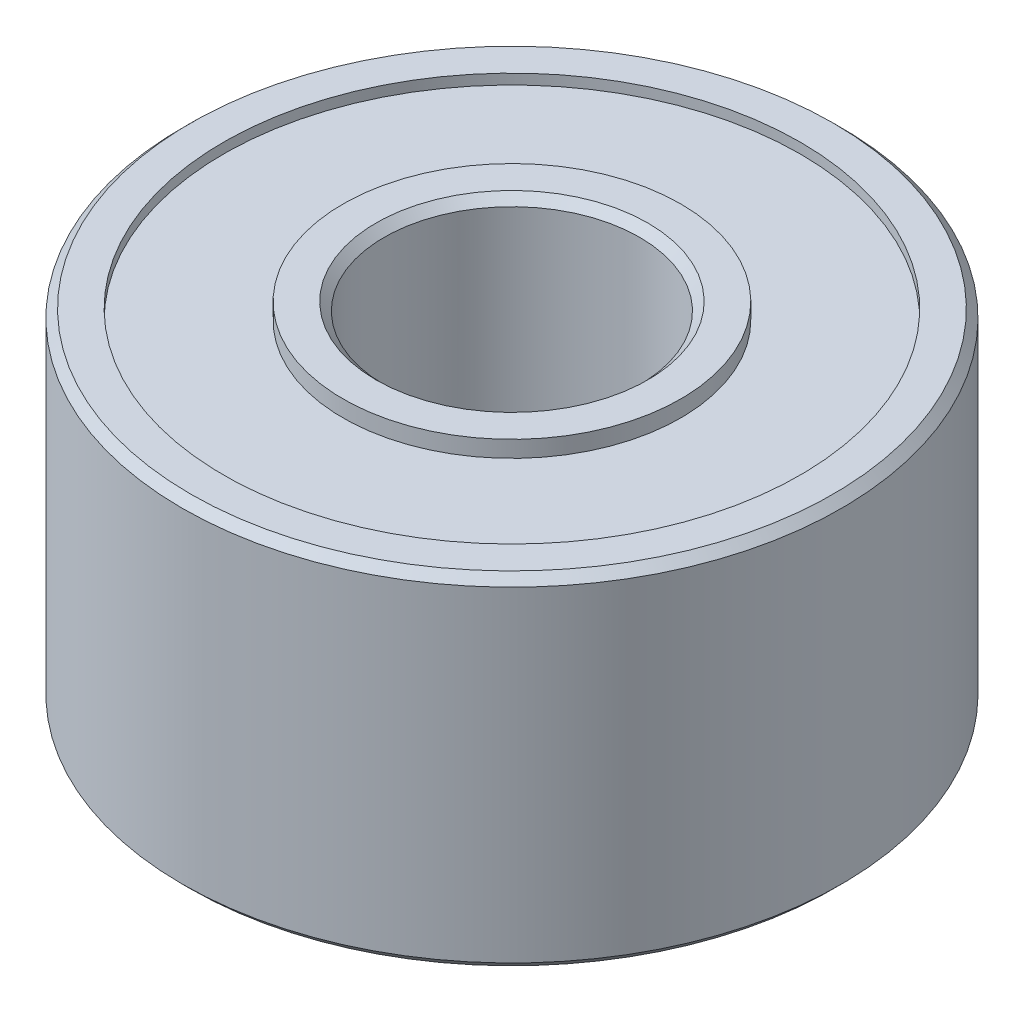
ISO-10303-21;
HEADER;
FILE_DESCRIPTION(('STEP AP214'),'2;1');
FILE_NAME('part.step','',(''),(''),'','','');
FILE_SCHEMA(('AUTOMOTIVE_DESIGN { 1 0 10303 214 1 1 1 1 }'));
ENDSEC;
DATA;
#1=APPLICATION_CONTEXT('core data for automotive mechanical design processes');
#2=APPLICATION_PROTOCOL_DEFINITION('international standard','automotive_design',2000,#1);
#3=PRODUCT_CONTEXT('',#1,'mechanical');
#4=PRODUCT('Part','Part','',(#3));
#5=PRODUCT_RELATED_PRODUCT_CATEGORY('part','',(#4));
#6=PRODUCT_DEFINITION_FORMATION('','',#4);
#7=PRODUCT_DEFINITION_CONTEXT('part definition',#1,'design');
#8=PRODUCT_DEFINITION('design','',#6,#7);
#9=PRODUCT_DEFINITION_SHAPE('','',#8);
#10=(LENGTH_UNIT() NAMED_UNIT(*) SI_UNIT(.MILLI.,.METRE.));
#11=(NAMED_UNIT(*) PLANE_ANGLE_UNIT() SI_UNIT($,.RADIAN.));
#12=(NAMED_UNIT(*) SI_UNIT($,.STERADIAN.) SOLID_ANGLE_UNIT());
#13=UNCERTAINTY_MEASURE_WITH_UNIT(LENGTH_MEASURE(1.E-05),#10,'distance_accuracy_value','');
#14=(GEOMETRIC_REPRESENTATION_CONTEXT(3) GLOBAL_UNCERTAINTY_ASSIGNED_CONTEXT((#13)) GLOBAL_UNIT_ASSIGNED_CONTEXT((#10,
#11,#12)) REPRESENTATION_CONTEXT('',''));
#15=CARTESIAN_POINT('',(0.,0.,0.));
#16=DIRECTION('',(0.,0.,1.));
#17=DIRECTION('',(1.,0.,0.));
#18=AXIS2_PLACEMENT_3D('',#15,#16,#17);
#19=CARTESIAN_POINT('',(0.,-2.,0.));
#20=DIRECTION('',(0.,-1.,0.));
#21=DIRECTION('',(0.,0.,-1.));
#22=AXIS2_PLACEMENT_3D('',#19,#20,#21);
#23=CYLINDRICAL_SURFACE('',#22,4.);
#24=CARTESIAN_POINT('',(0.,-1.975,0.));
#25=DIRECTION('',(0.,-1.,0.));
#26=DIRECTION('',(0.,0.,-1.));
#27=AXIS2_PLACEMENT_3D('',#24,#25,#26);
#28=CIRCLE('',#27,4.);
#29=CARTESIAN_POINT('',(0.,-1.975,4.));
#30=VERTEX_POINT('',#29);
#31=EDGE_CURVE('E59',#30,#30,#28,.F.);
#32=ORIENTED_EDGE('',*,*,#31,.T.);
#33=EDGE_LOOP('',(#32));
#34=FACE_BOUND('',#33,.T.);
#35=CARTESIAN_POINT('',(0.,1.975,0.));
#36=DIRECTION('',(0.,1.,0.));
#37=DIRECTION('',(0.,0.,1.));
#38=AXIS2_PLACEMENT_3D('',#35,#36,#37);
#39=CIRCLE('',#38,4.);
#40=CARTESIAN_POINT('',(0.,1.975,4.));
#41=VERTEX_POINT('',#40);
#42=EDGE_CURVE('E64',#41,#41,#39,.F.);
#43=ORIENTED_EDGE('',*,*,#42,.T.);
#44=EDGE_LOOP('',(#43));
#45=FACE_BOUND('',#44,.T.);
#46=ADVANCED_FACE('F45',(#34,#45),#23,.T.);
#47=CARTESIAN_POINT('',(4.,2.075,0.));
#48=DIRECTION('',(0.,1.,0.));
#49=DIRECTION('',(0.,0.,1.));
#50=AXIS2_PLACEMENT_3D('',#47,#48,#49);
#51=PLANE('',#50);
#52=CARTESIAN_POINT('',(0.,2.075,0.));
#53=DIRECTION('',(0.,1.,0.));
#54=DIRECTION('',(0.,0.,1.));
#55=AXIS2_PLACEMENT_3D('',#52,#53,#54);
#56=CIRCLE('',#55,3.9);
#57=CARTESIAN_POINT('',(0.,2.075,3.9));
#58=VERTEX_POINT('',#57);
#59=EDGE_CURVE('E10',#58,#58,#56,.T.);
#60=ORIENTED_EDGE('',*,*,#59,.T.);
#61=EDGE_LOOP('',(#60));
#62=FACE_BOUND('',#61,.T.);
#63=CARTESIAN_POINT('',(0.,2.075,0.));
#64=DIRECTION('',(0.,-1.,0.));
#65=DIRECTION('',(0.,0.,-1.));
#66=AXIS2_PLACEMENT_3D('',#63,#64,#65);
#67=CIRCLE('',#66,3.5);
#68=CARTESIAN_POINT('',(0.,2.075,-3.5));
#69=VERTEX_POINT('',#68);
#70=EDGE_CURVE('E86',#69,#69,#67,.T.);
#71=ORIENTED_EDGE('',*,*,#70,.T.);
#72=EDGE_LOOP('',(#71));
#73=FACE_BOUND('',#72,.T.);
#74=ADVANCED_FACE('F138',(#62,#73),#51,.T.);
#75=CARTESIAN_POINT('',(0.,-2.,0.));
#76=DIRECTION('',(0.,-1.,0.));
#77=DIRECTION('',(0.,0.,-1.));
#78=AXIS2_PLACEMENT_3D('',#75,#76,#77);
#79=CYLINDRICAL_SURFACE('',#78,3.5);
#80=CARTESIAN_POINT('',(0.,1.95,0.));
#81=DIRECTION('',(0.,-1.,0.));
#82=DIRECTION('',(0.,0.,-1.));
#83=AXIS2_PLACEMENT_3D('',#80,#81,#82);
#84=CIRCLE('',#83,3.5);
#85=CARTESIAN_POINT('',(0.,1.95,-3.5));
#86=VERTEX_POINT('',#85);
#87=EDGE_CURVE('E90',#86,#86,#84,.T.);
#88=ORIENTED_EDGE('',*,*,#87,.T.);
#89=EDGE_LOOP('',(#88));
#90=FACE_BOUND('',#89,.T.);
#91=ORIENTED_EDGE('',*,*,#70,.F.);
#92=EDGE_LOOP('',(#91));
#93=FACE_BOUND('',#92,.T.);
#94=ADVANCED_FACE('F144',(#90,#93),#79,.F.);
#95=CARTESIAN_POINT('',(3.5,1.95,0.));
#96=DIRECTION('',(0.,1.,0.));
#97=DIRECTION('',(0.,0.,1.));
#98=AXIS2_PLACEMENT_3D('',#95,#96,#97);
#99=PLANE('',#98);
#100=CARTESIAN_POINT('',(0.,1.95,0.));
#101=DIRECTION('',(0.,-1.,0.));
#102=DIRECTION('',(0.,0.,-1.));
#103=AXIS2_PLACEMENT_3D('',#100,#101,#102);
#104=CIRCLE('',#103,2.05);
#105=CARTESIAN_POINT('',(0.,1.95,-2.05));
#106=VERTEX_POINT('',#105);
#107=EDGE_CURVE('E94',#106,#106,#104,.T.);
#108=ORIENTED_EDGE('',*,*,#107,.T.);
#109=EDGE_LOOP('',(#108));
#110=FACE_BOUND('',#109,.T.);
#111=ORIENTED_EDGE('',*,*,#87,.F.);
#112=EDGE_LOOP('',(#111));
#113=FACE_BOUND('',#112,.T.);
#114=ADVANCED_FACE('F188',(#110,#113),#99,.T.);
#115=CARTESIAN_POINT('',(0.,-2.,0.));
#116=DIRECTION('',(0.,-1.,0.));
#117=DIRECTION('',(0.,0.,-1.));
#118=AXIS2_PLACEMENT_3D('',#115,#116,#117);
#119=CYLINDRICAL_SURFACE('',#118,2.05);
#120=CARTESIAN_POINT('',(0.,2.15,0.));
#121=DIRECTION('',(0.,-1.,0.));
#122=DIRECTION('',(0.,0.,-1.));
#123=AXIS2_PLACEMENT_3D('',#120,#121,#122);
#124=CIRCLE('',#123,2.05);
#125=CARTESIAN_POINT('',(0.,2.15,-2.05));
#126=VERTEX_POINT('',#125);
#127=EDGE_CURVE('E98',#126,#126,#124,.T.);
#128=ORIENTED_EDGE('',*,*,#127,.T.);
#129=EDGE_LOOP('',(#128));
#130=FACE_BOUND('',#129,.T.);
#131=ORIENTED_EDGE('',*,*,#107,.F.);
#132=EDGE_LOOP('',(#131));
#133=FACE_BOUND('',#132,.T.);
#134=ADVANCED_FACE('F182',(#130,#133),#119,.T.);
#135=CARTESIAN_POINT('',(2.05,2.15,0.));
#136=DIRECTION('',(0.,1.,0.));
#137=DIRECTION('',(0.,0.,1.));
#138=AXIS2_PLACEMENT_3D('',#135,#136,#137);
#139=PLANE('',#138);
#140=CARTESIAN_POINT('',(0.,2.15,0.));
#141=DIRECTION('',(0.,1.,0.));
#142=DIRECTION('',(0.,0.,1.));
#143=AXIS2_PLACEMENT_3D('',#140,#141,#142);
#144=CIRCLE('',#143,1.65);
#145=CARTESIAN_POINT('',(0.,2.15,1.65));
#146=VERTEX_POINT('',#145);
#147=EDGE_CURVE('E54',#146,#146,#144,.F.);
#148=ORIENTED_EDGE('',*,*,#147,.T.);
#149=EDGE_LOOP('',(#148));
#150=FACE_BOUND('',#149,.T.);
#151=ORIENTED_EDGE('',*,*,#127,.F.);
#152=EDGE_LOOP('',(#151));
#153=FACE_BOUND('',#152,.T.);
#154=ADVANCED_FACE('F173',(#150,#153),#139,.T.);
#155=CARTESIAN_POINT('',(0.,-2.,0.));
#156=DIRECTION('',(0.,-1.,0.));
#157=DIRECTION('',(0.,0.,-1.));
#158=AXIS2_PLACEMENT_3D('',#155,#156,#157);
#159=CYLINDRICAL_SURFACE('',#158,1.55);
#160=CARTESIAN_POINT('',(0.,-2.05,0.));
#161=DIRECTION('',(0.,-1.,0.));
#162=DIRECTION('',(0.,0.,-1.));
#163=AXIS2_PLACEMENT_3D('',#160,#161,#162);
#164=CIRCLE('',#163,1.55);
#165=CARTESIAN_POINT('',(0.,-2.05,-1.55));
#166=VERTEX_POINT('',#165);
#167=EDGE_CURVE('E78',#166,#166,#164,.T.);
#168=ORIENTED_EDGE('',*,*,#167,.T.);
#169=EDGE_LOOP('',(#168));
#170=FACE_BOUND('',#169,.T.);
#171=CARTESIAN_POINT('',(0.,2.05,0.));
#172=DIRECTION('',(0.,1.,0.));
#173=DIRECTION('',(0.,0.,1.));
#174=AXIS2_PLACEMENT_3D('',#171,#172,#173);
#175=CIRCLE('',#174,1.55);
#176=CARTESIAN_POINT('',(0.,2.05,1.55));
#177=VERTEX_POINT('',#176);
#178=EDGE_CURVE('E82',#177,#177,#175,.T.);
#179=ORIENTED_EDGE('',*,*,#178,.T.);
#180=EDGE_LOOP('',(#179));
#181=FACE_BOUND('',#180,.T.);
#182=ADVANCED_FACE('F170',(#170,#181),#159,.F.);
#183=CARTESIAN_POINT('',(1.55,-2.15,0.));
#184=DIRECTION('',(0.,-1.,0.));
#185=DIRECTION('',(0.,0.,-1.));
#186=AXIS2_PLACEMENT_3D('',#183,#184,#185);
#187=PLANE('',#186);
#188=CARTESIAN_POINT('',(0.,-2.15,0.));
#189=DIRECTION('',(0.,-1.,0.));
#190=DIRECTION('',(0.,0.,-1.));
#191=AXIS2_PLACEMENT_3D('',#188,#189,#190);
#192=CIRCLE('',#191,1.65000000000001);
#193=CARTESIAN_POINT('',(0.,-2.15,-1.65000000000001));
#194=VERTEX_POINT('',#193);
#195=EDGE_CURVE('E74',#194,#194,#192,.F.);
#196=ORIENTED_EDGE('',*,*,#195,.T.);
#197=EDGE_LOOP('',(#196));
#198=FACE_BOUND('',#197,.T.);
#199=CARTESIAN_POINT('',(0.,-2.15,0.));
#200=DIRECTION('',(0.,-1.,0.));
#201=DIRECTION('',(0.,0.,-1.));
#202=AXIS2_PLACEMENT_3D('',#199,#200,#201);
#203=CIRCLE('',#202,2.05);
#204=CARTESIAN_POINT('',(0.,-2.15,-2.05));
#205=VERTEX_POINT('',#204);
#206=EDGE_CURVE('E102',#205,#205,#203,.T.);
#207=ORIENTED_EDGE('',*,*,#206,.T.);
#208=EDGE_LOOP('',(#207));
#209=FACE_BOUND('',#208,.T.);
#210=ADVANCED_FACE('F172',(#198,#209),#187,.T.);
#211=CARTESIAN_POINT('',(0.,-2.,0.));
#212=DIRECTION('',(0.,-1.,0.));
#213=DIRECTION('',(0.,0.,-1.));
#214=AXIS2_PLACEMENT_3D('',#211,#212,#213);
#215=CYLINDRICAL_SURFACE('',#214,2.05);
#216=CARTESIAN_POINT('',(0.,-1.95,0.));
#217=DIRECTION('',(0.,-1.,0.));
#218=DIRECTION('',(0.,0.,-1.));
#219=AXIS2_PLACEMENT_3D('',#216,#217,#218);
#220=CIRCLE('',#219,2.05);
#221=CARTESIAN_POINT('',(0.,-1.95,-2.05));
#222=VERTEX_POINT('',#221);
#223=EDGE_CURVE('E106',#222,#222,#220,.T.);
#224=ORIENTED_EDGE('',*,*,#223,.T.);
#225=EDGE_LOOP('',(#224));
#226=FACE_BOUND('',#225,.T.);
#227=ORIENTED_EDGE('',*,*,#206,.F.);
#228=EDGE_LOOP('',(#227));
#229=FACE_BOUND('',#228,.T.);
#230=ADVANCED_FACE('F179',(#226,#229),#215,.T.);
#231=CARTESIAN_POINT('',(2.05,-1.95,0.));
#232=DIRECTION('',(0.,-1.,0.));
#233=DIRECTION('',(0.,0.,-1.));
#234=AXIS2_PLACEMENT_3D('',#231,#232,#233);
#235=PLANE('',#234);
#236=CARTESIAN_POINT('',(0.,-1.95,0.));
#237=DIRECTION('',(0.,-1.,0.));
#238=DIRECTION('',(0.,0.,-1.));
#239=AXIS2_PLACEMENT_3D('',#236,#237,#238);
#240=CIRCLE('',#239,3.5);
#241=CARTESIAN_POINT('',(0.,-1.95,-3.5));
#242=VERTEX_POINT('',#241);
#243=EDGE_CURVE('E110',#242,#242,#240,.T.);
#244=ORIENTED_EDGE('',*,*,#243,.T.);
#245=EDGE_LOOP('',(#244));
#246=FACE_BOUND('',#245,.T.);
#247=ORIENTED_EDGE('',*,*,#223,.F.);
#248=EDGE_LOOP('',(#247));
#249=FACE_BOUND('',#248,.T.);
#250=ADVANCED_FACE('F135',(#246,#249),#235,.T.);
#251=CARTESIAN_POINT('',(0.,-2.,0.));
#252=DIRECTION('',(0.,-1.,0.));
#253=DIRECTION('',(0.,0.,-1.));
#254=AXIS2_PLACEMENT_3D('',#251,#252,#253);
#255=CYLINDRICAL_SURFACE('',#254,3.5);
#256=CARTESIAN_POINT('',(0.,-2.075,0.));
#257=DIRECTION('',(0.,-1.,0.));
#258=DIRECTION('',(0.,0.,-1.));
#259=AXIS2_PLACEMENT_3D('',#256,#257,#258);
#260=CIRCLE('',#259,3.5);
#261=CARTESIAN_POINT('',(0.,-2.075,-3.5));
#262=VERTEX_POINT('',#261);
#263=EDGE_CURVE('E114',#262,#262,#260,.T.);
#264=ORIENTED_EDGE('',*,*,#263,.T.);
#265=EDGE_LOOP('',(#264));
#266=FACE_BOUND('',#265,.T.);
#267=ORIENTED_EDGE('',*,*,#243,.F.);
#268=EDGE_LOOP('',(#267));
#269=FACE_BOUND('',#268,.T.);
#270=ADVANCED_FACE('F119',(#266,#269),#255,.F.);
#271=CARTESIAN_POINT('',(3.5,-2.075,0.));
#272=DIRECTION('',(0.,-1.,0.));
#273=DIRECTION('',(0.,0.,-1.));
#274=AXIS2_PLACEMENT_3D('',#271,#272,#273);
#275=PLANE('',#274);
#276=CARTESIAN_POINT('',(0.,-2.075,0.));
#277=DIRECTION('',(0.,-1.,0.));
#278=DIRECTION('',(0.,0.,-1.));
#279=AXIS2_PLACEMENT_3D('',#276,#277,#278);
#280=CIRCLE('',#279,3.9);
#281=CARTESIAN_POINT('',(0.,-2.075,3.9));
#282=VERTEX_POINT('',#281);
#283=EDGE_CURVE('E70',#282,#282,#280,.T.);
#284=ORIENTED_EDGE('',*,*,#283,.T.);
#285=EDGE_LOOP('',(#284));
#286=FACE_BOUND('',#285,.T.);
#287=ORIENTED_EDGE('',*,*,#263,.F.);
#288=EDGE_LOOP('',(#287));
#289=FACE_BOUND('',#288,.T.);
#290=ADVANCED_FACE('F122',(#286,#289),#275,.T.);
#291=CARTESIAN_POINT('',(0.,-2.05,0.));
#292=DIRECTION('',(0.,-1.,0.));
#293=DIRECTION('',(0.,0.,-1.));
#294=AXIS2_PLACEMENT_3D('',#291,#292,#293);
#295=CONICAL_SURFACE('',#294,1.55,0.785398163397459);
#296=ORIENTED_EDGE('',*,*,#195,.F.);
#297=EDGE_LOOP('',(#296));
#298=FACE_BOUND('',#297,.T.);
#299=ORIENTED_EDGE('',*,*,#167,.F.);
#300=EDGE_LOOP('',(#299));
#301=FACE_BOUND('',#300,.T.);
#302=ADVANCED_FACE('F124',(#298,#301),#295,.F.);
#303=CARTESIAN_POINT('',(0.,-2.075,0.));
#304=DIRECTION('',(0.,1.,0.));
#305=DIRECTION('',(0.,0.,1.));
#306=AXIS2_PLACEMENT_3D('',#303,#304,#305);
#307=CONICAL_SURFACE('',#306,3.9,0.785398163397448);
#308=CARTESIAN_POINT('',(0.,-1.975,4.));
#309=CARTESIAN_POINT('',(0.,-1.97604166666667,3.99895833333333));
#310=CARTESIAN_POINT('',(0.,-1.97708333333334,3.99791666666667));
#311=CARTESIAN_POINT('',(0.,-1.97916666666667,3.99583333333333));
#312=CARTESIAN_POINT('',(0.,-1.98020833333334,3.99479166666667));
#313=CARTESIAN_POINT('',(0.,-1.98229166666667,3.99270833333334));
#314=CARTESIAN_POINT('',(0.,-1.98333333333334,3.99166666666667));
#315=CARTESIAN_POINT('',(0.,-1.98541666666667,3.98958333333333));
#316=CARTESIAN_POINT('',(0.,-1.98645833333334,3.98854166666667));
#317=CARTESIAN_POINT('',(0.,-1.98854166666667,3.98645833333333));
#318=CARTESIAN_POINT('',(0.,-1.98958333333334,3.98541666666667));
#319=CARTESIAN_POINT('',(0.,-1.99166666666667,3.98333333333334));
#320=CARTESIAN_POINT('',(0.,-1.99270833333334,3.98229166666667));
#321=CARTESIAN_POINT('',(0.,-1.99479166666667,3.98020833333334));
#322=CARTESIAN_POINT('',(0.,-1.99583333333334,3.97916666666667));
#323=CARTESIAN_POINT('',(0.,-1.99791666666667,3.97708333333334));
#324=CARTESIAN_POINT('',(0.,-1.99895833333334,3.97604166666667));
#325=CARTESIAN_POINT('',(0.,-2.00104166666667,3.97395833333334));
#326=CARTESIAN_POINT('',(0.,-2.00208333333334,3.97291666666667));
#327=CARTESIAN_POINT('',(0.,-2.00416666666667,3.97083333333334));
#328=CARTESIAN_POINT('',(0.,-2.00520833333334,3.96979166666667));
#329=CARTESIAN_POINT('',(0.,-2.00729166666667,3.96770833333334));
#330=CARTESIAN_POINT('',(0.,-2.00833333333334,3.96666666666667));
#331=CARTESIAN_POINT('',(0.,-2.01041666666667,3.96458333333334));
#332=CARTESIAN_POINT('',(0.,-2.01145833333334,3.96354166666667));
#333=CARTESIAN_POINT('',(0.,-2.01354166666667,3.96145833333334));
#334=CARTESIAN_POINT('',(0.,-2.01458333333334,3.96041666666667));
#335=CARTESIAN_POINT('',(0.,-2.01666666666667,3.95833333333334));
#336=CARTESIAN_POINT('',(0.,-2.01770833333334,3.95729166666667));
#337=CARTESIAN_POINT('',(0.,-2.01979166666667,3.95520833333334));
#338=CARTESIAN_POINT('',(0.,-2.02083333333334,3.95416666666667));
#339=CARTESIAN_POINT('',(0.,-2.02291666666667,3.95208333333334));
#340=CARTESIAN_POINT('',(0.,-2.02395833333334,3.95104166666667));
#341=CARTESIAN_POINT('',(0.,-2.02604166666667,3.94895833333334));
#342=CARTESIAN_POINT('',(0.,-2.02708333333334,3.94791666666667));
#343=CARTESIAN_POINT('',(0.,-2.02916666666667,3.94583333333334));
#344=CARTESIAN_POINT('',(0.,-2.03020833333334,3.94479166666667));
#345=CARTESIAN_POINT('',(0.,-2.03229166666667,3.94270833333334));
#346=CARTESIAN_POINT('',(0.,-2.03333333333334,3.94166666666667));
#347=CARTESIAN_POINT('',(0.,-2.03541666666667,3.93958333333334));
#348=CARTESIAN_POINT('',(0.,-2.03645833333334,3.93854166666667));
#349=CARTESIAN_POINT('',(0.,-2.03854166666667,3.93645833333334));
#350=CARTESIAN_POINT('',(0.,-2.03958333333334,3.93541666666667));
#351=CARTESIAN_POINT('',(0.,-2.04166666666667,3.93333333333334));
#352=CARTESIAN_POINT('',(0.,-2.04270833333334,3.93229166666667));
#353=CARTESIAN_POINT('',(0.,-2.04479166666667,3.93020833333334));
#354=CARTESIAN_POINT('',(0.,-2.04583333333333,3.92916666666667));
#355=CARTESIAN_POINT('',(0.,-2.04791666666667,3.92708333333334));
#356=CARTESIAN_POINT('',(0.,-2.04895833333333,3.92604166666667));
#357=CARTESIAN_POINT('',(0.,-2.05104166666667,3.92395833333334));
#358=CARTESIAN_POINT('',(0.,-2.05208333333333,3.92291666666667));
#359=CARTESIAN_POINT('',(0.,-2.05416666666667,3.92083333333334));
#360=CARTESIAN_POINT('',(0.,-2.05520833333333,3.91979166666667));
#361=CARTESIAN_POINT('',(0.,-2.05729166666667,3.91770833333334));
#362=CARTESIAN_POINT('',(0.,-2.05833333333333,3.91666666666667));
#363=CARTESIAN_POINT('',(0.,-2.06041666666667,3.91458333333334));
#364=CARTESIAN_POINT('',(0.,-2.06145833333333,3.91354166666667));
#365=CARTESIAN_POINT('',(0.,-2.06354166666667,3.91145833333334));
#366=CARTESIAN_POINT('',(0.,-2.06458333333333,3.91041666666667));
#367=CARTESIAN_POINT('',(0.,-2.06666666666667,3.90833333333334));
#368=CARTESIAN_POINT('',(0.,-2.06770833333333,3.90729166666667));
#369=CARTESIAN_POINT('',(0.,-2.06979166666667,3.90520833333334));
#370=CARTESIAN_POINT('',(0.,-2.07083333333333,3.90416666666667));
#371=CARTESIAN_POINT('',(0.,-2.07291666666667,3.90208333333334));
#372=CARTESIAN_POINT('',(0.,-2.07395833333333,3.90104166666667));
#373=CARTESIAN_POINT('',(0.,-2.075,3.9));
#374=B_SPLINE_CURVE_WITH_KNOTS('',3,(#308,#309,#310,#311,#312,#313,#314,#315,#316,#317,#318,
#319,#320,#321,#322,#323,#324,#325,#326,#327,#328,#329,#330,#331,#332,#333,#334,#335,#336,#337,
#338,#339,#340,#341,#342,#343,#344,#345,#346,#347,#348,#349,#350,#351,#352,#353,#354,#355,#356,
#357,#358,#359,#360,#361,#362,#363,#364,#365,#366,#367,#368,#369,#370,#371,#372,#373),
.UNSPECIFIED.,.F.,.F.,(4,2,2,2,2,2,2,2,2,2,2,2,2,2,2,2,2,2,2,2,2,2,2,2,2,2,2,2,2,2,2,2,4),(0.,
0.00441941738241544,0.00883883476483118,0.0132582521472472,0.017677669529663,0.0220970869120784,
0.0265165042944941,0.0309359216769102,0.0353553390593259,0.0397747564417417,0.0441941738241577,
0.0486135912065735,0.0530330085889889,0.0574524259714046,0.0618718433538207,0.0662912607362364,
0.0707106781186522,0.0751300955010682,0.079549512883484,0.0839689302658994,0.0883883476483151,
0.0928077650307312,0.0972271824131469,0.101646599795562,0.106066017177979,0.110485434560394,
0.11490485194281,0.119324269325226,0.123743686707642,0.128163104090057,0.132582521472473,
0.137001938854889,0.141421356237305),.UNSPECIFIED.);
#375=EDGE_CURVE('BSEAM131',#30,#282,#374,.T.);
#376=ORIENTED_EDGE('',*,*,#31,.F.);
#377=ORIENTED_EDGE('',*,*,#283,.F.);
#378=ORIENTED_EDGE('',*,*,#375,.T.);
#379=ORIENTED_EDGE('',*,*,#375,.F.);
#380=EDGE_LOOP('',(#376,#378,#377,#379));
#381=FACE_BOUND('',#380,.T.);
#382=ADVANCED_FACE('F131',(#381),#307,.T.);
#383=CARTESIAN_POINT('',(0.,2.15,0.));
#384=DIRECTION('',(0.,1.,0.));
#385=DIRECTION('',(0.,0.,1.));
#386=AXIS2_PLACEMENT_3D('',#383,#384,#385);
#387=CONICAL_SURFACE('',#386,1.65,0.785398163397442);
#388=ORIENTED_EDGE('',*,*,#178,.F.);
#389=EDGE_LOOP('',(#388));
#390=FACE_BOUND('',#389,.T.);
#391=ORIENTED_EDGE('',*,*,#147,.F.);
#392=EDGE_LOOP('',(#391));
#393=FACE_BOUND('',#392,.T.);
#394=ADVANCED_FACE('F157',(#390,#393),#387,.F.);
#395=CARTESIAN_POINT('',(0.,1.975,0.));
#396=DIRECTION('',(0.,-1.,0.));
#397=DIRECTION('',(0.,0.,-1.));
#398=AXIS2_PLACEMENT_3D('',#395,#396,#397);
#399=CONICAL_SURFACE('',#398,4.,0.785398163397457);
#400=ORIENTED_EDGE('',*,*,#59,.F.);
#401=EDGE_LOOP('',(#400));
#402=FACE_BOUND('',#401,.T.);
#403=ORIENTED_EDGE('',*,*,#42,.F.);
#404=EDGE_LOOP('',(#403));
#405=FACE_BOUND('',#404,.T.);
#406=ADVANCED_FACE('F48',(#402,#405),#399,.T.);
#407=CLOSED_SHELL('',(#46,#74,#94,#114,#134,#154,#182,#210,#230,#250,#270,#290,#302,#382,#394,#406));
#408=MANIFOLD_SOLID_BREP('B2',#407);
#409=ADVANCED_BREP_SHAPE_REPRESENTATION('',(#18,#408),#14);
#410=SHAPE_DEFINITION_REPRESENTATION(#9,#409);
ENDSEC;
END-ISO-10303-21;
